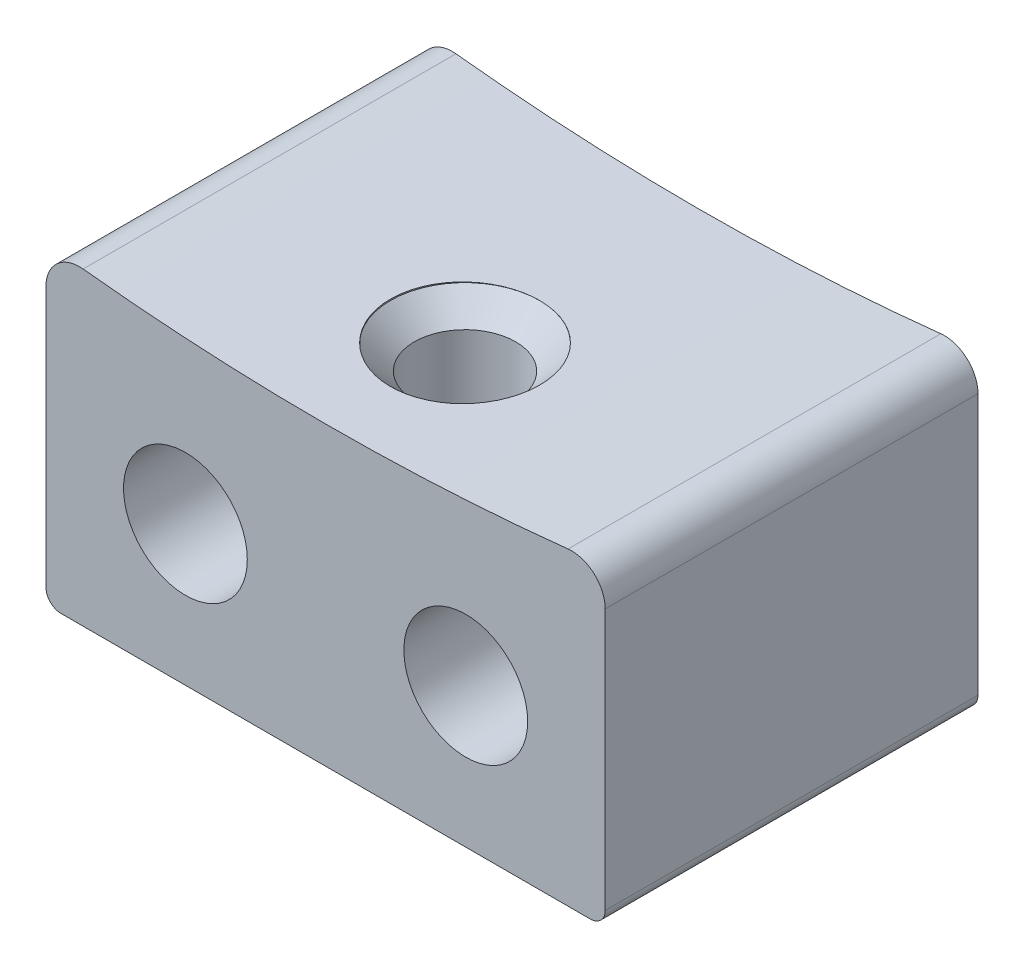
ISO-10303-21;
HEADER;
FILE_DESCRIPTION(('STEP AP214'),'2;1');
FILE_NAME('part.step','',(''),(''),'','','');
FILE_SCHEMA(('AUTOMOTIVE_DESIGN { 1 0 10303 214 1 1 1 1 }'));
ENDSEC;
DATA;
#1=APPLICATION_CONTEXT('core data for automotive mechanical design processes');
#2=APPLICATION_PROTOCOL_DEFINITION('international standard','automotive_design',2000,#1);
#3=PRODUCT_CONTEXT('',#1,'mechanical');
#4=PRODUCT('Part','Part','',(#3));
#5=PRODUCT_RELATED_PRODUCT_CATEGORY('part','',(#4));
#6=PRODUCT_DEFINITION_FORMATION('','',#4);
#7=PRODUCT_DEFINITION_CONTEXT('part definition',#1,'design');
#8=PRODUCT_DEFINITION('design','',#6,#7);
#9=PRODUCT_DEFINITION_SHAPE('','',#8);
#10=(LENGTH_UNIT() NAMED_UNIT(*) SI_UNIT(.MILLI.,.METRE.));
#11=(NAMED_UNIT(*) PLANE_ANGLE_UNIT() SI_UNIT($,.RADIAN.));
#12=(NAMED_UNIT(*) SI_UNIT($,.STERADIAN.) SOLID_ANGLE_UNIT());
#13=UNCERTAINTY_MEASURE_WITH_UNIT(LENGTH_MEASURE(1.E-05),#10,'distance_accuracy_value','');
#14=(GEOMETRIC_REPRESENTATION_CONTEXT(3) GLOBAL_UNCERTAINTY_ASSIGNED_CONTEXT((#13)) GLOBAL_UNIT_ASSIGNED_CONTEXT((#10,
#11,#12)) REPRESENTATION_CONTEXT('',''));
#15=CARTESIAN_POINT('',(0.,0.,0.));
#16=DIRECTION('',(0.,0.,1.));
#17=DIRECTION('',(1.,0.,0.));
#18=AXIS2_PLACEMENT_3D('',#15,#16,#17);
#19=CARTESIAN_POINT('',(-9.017,-86.8045,12.7));
#20=DIRECTION('',(0.,0.,-1.));
#21=DIRECTION('',(-1.,0.,0.));
#22=AXIS2_PLACEMENT_3D('',#19,#20,#21);
#23=CYLINDRICAL_SURFACE('',#22,0.507999999999997);
#24=CARTESIAN_POINT('',(-9.017,-86.8045,0.));
#25=DIRECTION('',(0.,0.,1.));
#26=DIRECTION('',(-1.,0.,0.));
#27=AXIS2_PLACEMENT_3D('',#24,#25,#26);
#28=CIRCLE('',#27,0.507999999999997);
#29=CARTESIAN_POINT('',(-9.525,-86.8045,0.));
#30=VERTEX_POINT('',#29);
#31=CARTESIAN_POINT('',(-9.017,-87.3125,0.));
#32=VERTEX_POINT('',#31);
#33=EDGE_CURVE('E150',#30,#32,#28,.T.);
#34=ORIENTED_EDGE('',*,*,#33,.T.);
#35=DIRECTION('',(0.,0.,-1.));
#36=VECTOR('',#35,1.);
#37=CARTESIAN_POINT('',(-9.017,-87.3125,12.7));
#38=LINE('',#37,#36);
#39=CARTESIAN_POINT('',(-9.017,-87.3125,12.7));
#40=VERTEX_POINT('',#39);
#41=EDGE_CURVE('E178',#40,#32,#38,.T.);
#42=ORIENTED_EDGE('',*,*,#41,.F.);
#43=CARTESIAN_POINT('',(-9.017,-86.8045,12.7));
#44=DIRECTION('',(0.,0.,1.));
#45=DIRECTION('',(-1.,0.,0.));
#46=AXIS2_PLACEMENT_3D('',#43,#44,#45);
#47=CIRCLE('',#46,0.507999999999997);
#48=CARTESIAN_POINT('',(-9.525,-86.8045,12.7));
#49=VERTEX_POINT('',#48);
#50=EDGE_CURVE('E166',#49,#40,#47,.T.);
#51=ORIENTED_EDGE('',*,*,#50,.F.);
#52=DIRECTION('',(0.,0.,-1.));
#53=VECTOR('',#52,1.);
#54=CARTESIAN_POINT('',(-9.525,-86.8045,12.7));
#55=LINE('',#54,#53);
#56=EDGE_CURVE('E145',#49,#30,#55,.T.);
#57=ORIENTED_EDGE('',*,*,#56,.T.);
#58=EDGE_LOOP('',(#34,#42,#51,#57));
#59=FACE_BOUND('',#58,.T.);
#60=ADVANCED_FACE('F39',(#59),#23,.T.);
#61=CARTESIAN_POINT('',(9.017,-87.3125,12.7));
#62=DIRECTION('',(0.,1.,0.));
#63=DIRECTION('',(0.,0.,1.));
#64=AXIS2_PLACEMENT_3D('',#61,#62,#63);
#65=PLANE('',#64);
#66=CARTESIAN_POINT('',(0.,-87.3125,7.9502));
#67=DIRECTION('',(0.,-1.,0.));
#68=DIRECTION('',(0.,0.,-1.));
#69=AXIS2_PLACEMENT_3D('',#66,#67,#68);
#70=CIRCLE('',#69,2.286);
#71=CARTESIAN_POINT('',(0.,-87.3125,5.6642));
#72=VERTEX_POINT('',#71);
#73=EDGE_CURVE('E192',#72,#72,#70,.T.);
#74=ORIENTED_EDGE('',*,*,#73,.F.);
#75=EDGE_LOOP('',(#74));
#76=FACE_BOUND('',#75,.T.);
#77=DIRECTION('',(1.,0.,0.));
#78=VECTOR('',#77,1.);
#79=CARTESIAN_POINT('',(9.017,-87.3125,0.));
#80=LINE('',#79,#78);
#81=CARTESIAN_POINT('',(9.017,-87.3125,0.));
#82=VERTEX_POINT('',#81);
#83=EDGE_CURVE('E153',#32,#82,#80,.T.);
#84=ORIENTED_EDGE('',*,*,#83,.T.);
#85=DIRECTION('',(0.,0.,-1.));
#86=VECTOR('',#85,1.);
#87=CARTESIAN_POINT('',(9.017,-87.3125,12.7));
#88=LINE('',#87,#86);
#89=CARTESIAN_POINT('',(9.017,-87.3125,12.7));
#90=VERTEX_POINT('',#89);
#91=EDGE_CURVE('E176',#90,#82,#88,.T.);
#92=ORIENTED_EDGE('',*,*,#91,.F.);
#93=DIRECTION('',(1.,0.,0.));
#94=VECTOR('',#93,1.);
#95=CARTESIAN_POINT('',(9.017,-87.3125,12.7));
#96=LINE('',#95,#94);
#97=EDGE_CURVE('E107',#40,#90,#96,.T.);
#98=ORIENTED_EDGE('',*,*,#97,.F.);
#99=ORIENTED_EDGE('',*,*,#41,.T.);
#100=EDGE_LOOP('',(#84,#92,#98,#99));
#101=FACE_BOUND('',#100,.T.);
#102=ADVANCED_FACE('F237',(#76,#101),#65,.F.);
#103=CARTESIAN_POINT('',(9.017,-86.8045,12.7));
#104=DIRECTION('',(0.,0.,-1.));
#105=DIRECTION('',(-1.,0.,0.));
#106=AXIS2_PLACEMENT_3D('',#103,#104,#105);
#107=CYLINDRICAL_SURFACE('',#106,0.507999999999997);
#108=CARTESIAN_POINT('',(9.017,-86.8045,0.));
#109=DIRECTION('',(0.,0.,1.));
#110=DIRECTION('',(-1.,0.,0.));
#111=AXIS2_PLACEMENT_3D('',#108,#109,#110);
#112=CIRCLE('',#111,0.507999999999997);
#113=CARTESIAN_POINT('',(9.525,-86.8045,0.));
#114=VERTEX_POINT('',#113);
#115=EDGE_CURVE('E156',#82,#114,#112,.T.);
#116=ORIENTED_EDGE('',*,*,#115,.T.);
#117=DIRECTION('',(0.,0.,-1.));
#118=VECTOR('',#117,1.);
#119=CARTESIAN_POINT('',(9.525,-86.8045,12.7));
#120=LINE('',#119,#118);
#121=CARTESIAN_POINT('',(9.525,-86.8045,12.7));
#122=VERTEX_POINT('',#121);
#123=EDGE_CURVE('E173',#122,#114,#120,.T.);
#124=ORIENTED_EDGE('',*,*,#123,.F.);
#125=CARTESIAN_POINT('',(9.017,-86.8045,12.7));
#126=DIRECTION('',(0.,0.,1.));
#127=DIRECTION('',(-1.,0.,0.));
#128=AXIS2_PLACEMENT_3D('',#125,#126,#127);
#129=CIRCLE('',#128,0.507999999999997);
#130=EDGE_CURVE('E215',#90,#122,#129,.T.);
#131=ORIENTED_EDGE('',*,*,#130,.F.);
#132=ORIENTED_EDGE('',*,*,#91,.T.);
#133=EDGE_LOOP('',(#116,#124,#131,#132));
#134=FACE_BOUND('',#133,.T.);
#135=ADVANCED_FACE('F240',(#134),#107,.T.);
#136=CARTESIAN_POINT('',(9.525,-77.9094022374707,12.7));
#137=DIRECTION('',(-1.,0.,0.));
#138=DIRECTION('',(0.,-1.,0.));
#139=AXIS2_PLACEMENT_3D('',#136,#137,#138);
#140=PLANE('',#139);
#141=DIRECTION('',(0.,1.,0.));
#142=VECTOR('',#141,1.);
#143=CARTESIAN_POINT('',(9.525,-77.9094022374707,0.));
#144=LINE('',#143,#142);
#145=CARTESIAN_POINT('',(9.525,-77.9094022374707,0.));
#146=VERTEX_POINT('',#145);
#147=EDGE_CURVE('E158',#114,#146,#144,.T.);
#148=ORIENTED_EDGE('',*,*,#147,.T.);
#149=DIRECTION('',(0.,0.,-1.));
#150=VECTOR('',#149,1.);
#151=CARTESIAN_POINT('',(9.525,-77.9094022374707,12.7));
#152=LINE('',#151,#150);
#153=CARTESIAN_POINT('',(9.525,-77.9094022374707,12.7));
#154=VERTEX_POINT('',#153);
#155=EDGE_CURVE('E170',#154,#146,#152,.T.);
#156=ORIENTED_EDGE('',*,*,#155,.F.);
#157=DIRECTION('',(0.,1.,0.));
#158=VECTOR('',#157,1.);
#159=CARTESIAN_POINT('',(9.525,-77.9094022374707,12.7));
#160=LINE('',#159,#158);
#161=EDGE_CURVE('E220',#122,#154,#160,.T.);
#162=ORIENTED_EDGE('',*,*,#161,.F.);
#163=ORIENTED_EDGE('',*,*,#123,.T.);
#164=EDGE_LOOP('',(#148,#156,#162,#163));
#165=FACE_BOUND('',#164,.T.);
#166=ADVANCED_FACE('F226',(#165),#140,.F.);
#167=CARTESIAN_POINT('',(8.382,-77.9094022374707,12.7));
#168=DIRECTION('',(0.,0.,-1.));
#169=DIRECTION('',(-1.,0.,0.));
#170=AXIS2_PLACEMENT_3D('',#167,#168,#169);
#171=CYLINDRICAL_SURFACE('',#170,1.143);
#172=CARTESIAN_POINT('',(8.382,-77.9094022374707,0.));
#173=DIRECTION('',(0.,0.,1.));
#174=DIRECTION('',(-1.,0.,0.));
#175=AXIS2_PLACEMENT_3D('',#172,#173,#174);
#176=CIRCLE('',#175,1.143);
#177=CARTESIAN_POINT('',(8.25973419773096,-76.7729603895983,0.));
#178=VERTEX_POINT('',#177);
#179=EDGE_CURVE('E160',#146,#178,#176,.T.);
#180=ORIENTED_EDGE('',*,*,#179,.T.);
#181=DIRECTION('',(0.,0.,-1.));
#182=VECTOR('',#181,1.);
#183=CARTESIAN_POINT('',(8.25973419773096,-76.7729603895983,12.7));
#184=LINE('',#183,#182);
#185=CARTESIAN_POINT('',(8.25973419773096,-76.7729603895983,12.7));
#186=VERTEX_POINT('',#185);
#187=EDGE_CURVE('E140',#186,#178,#184,.T.);
#188=ORIENTED_EDGE('',*,*,#187,.F.);
#189=CARTESIAN_POINT('',(8.382,-77.9094022374707,12.7));
#190=DIRECTION('',(0.,0.,1.));
#191=DIRECTION('',(-1.,0.,0.));
#192=AXIS2_PLACEMENT_3D('',#189,#190,#191);
#193=CIRCLE('',#192,1.143);
#194=EDGE_CURVE('E128',#154,#186,#193,.T.);
#195=ORIENTED_EDGE('',*,*,#194,.F.);
#196=ORIENTED_EDGE('',*,*,#155,.T.);
#197=EDGE_LOOP('',(#180,#188,#195,#196));
#198=FACE_BOUND('',#197,.T.);
#199=ADVANCED_FACE('F230',(#198),#171,.T.);
#200=CARTESIAN_POINT('',(0.,0.,12.7));
#201=DIRECTION('',(0.,0.,-1.));
#202=DIRECTION('',(-1.,0.,0.));
#203=AXIS2_PLACEMENT_3D('',#200,#201,#202);
#204=CYLINDRICAL_SURFACE('',#203,77.216);
#205=CARTESIAN_POINT('',(0.,-77.216,5.4102));
#206=CARTESIAN_POINT('',(0.142631522054867,-77.2159994376022,5.41020631241256));
#207=CARTESIAN_POINT('',(0.285365482974128,-77.2156005630109,5.42225435536695));
#208=CARTESIAN_POINT('',(0.566899598449221,-77.2140477185647,5.4701476102734));
#209=CARTESIAN_POINT('',(0.705694855219714,-77.2128928481651,5.50602120404428));
#210=CARTESIAN_POINT('',(0.975232281978908,-77.2099587896718,5.60054067047672));
#211=CARTESIAN_POINT('',(1.10597837369403,-77.2081799084851,5.65917535006933));
#212=CARTESIAN_POINT('',(1.35573536611048,-77.2041984471788,5.79753637747094));
#213=CARTESIAN_POINT('',(1.47474911110521,-77.2019959701363,5.87725759588643));
#214=CARTESIAN_POINT('',(1.69776130614018,-77.1974140082537,6.05557669508534));
#215=CARTESIAN_POINT('',(1.80175309174933,-77.1950344455553,6.15418290927587));
#216=CARTESIAN_POINT('',(1.99171320334718,-77.190367187809,6.3674579297261));
#217=CARTESIAN_POINT('',(2.07768080946089,-77.1880794964334,6.48212737723677));
#218=CARTESIAN_POINT('',(2.22916444437867,-77.1838535353486,6.72430084112169));
#219=CARTESIAN_POINT('',(2.2946762068322,-77.181915338567,6.85180752755713));
#220=CARTESIAN_POINT('',(2.40336085350253,-77.1786076969655,7.11601704578485));
#221=CARTESIAN_POINT('',(2.44653383639373,-77.1772382496333,7.25271983695328));
#222=CARTESIAN_POINT('',(2.50930034841734,-77.1752231221408,7.5313882946801));
#223=CARTESIAN_POINT('',(2.52890247244731,-77.1745771781675,7.67335202340928));
#224=CARTESIAN_POINT('',(2.54399731928591,-77.1740810982679,7.95855644407232));
#225=CARTESIAN_POINT('',(2.53949014902687,-77.1742309588121,8.10179713033964));
#226=CARTESIAN_POINT('',(2.50650159316738,-77.1753093428756,8.3854310733836));
#227=CARTESIAN_POINT('',(2.4780294960392,-77.1762375647124,8.52582541177812));
#228=CARTESIAN_POINT('',(2.39793367691424,-77.1787675603712,8.79984057602987));
#229=CARTESIAN_POINT('',(2.34630989860137,-77.1803693358317,8.93346138540973));
#230=CARTESIAN_POINT('',(2.22136547301627,-77.1840662239566,9.19016638077214));
#231=CARTESIAN_POINT('',(2.14804057083833,-77.1861614333514,9.31324849434153));
#232=CARTESIAN_POINT('',(1.98177847491137,-77.1906089003664,9.54535951885899));
#233=CARTESIAN_POINT('',(1.88884122569133,-77.1929611587136,9.65438839005785));
#234=CARTESIAN_POINT('',(1.68594005697315,-77.1976589020917,9.85535210172363));
#235=CARTESIAN_POINT('',(1.57596808485946,-77.2000043833819,9.9472788122256));
#236=CARTESIAN_POINT('',(1.34214757008214,-77.2044230953484,10.1113661329868));
#237=CARTESIAN_POINT('',(1.21829902506159,-77.2064963259785,10.1835267398888));
#238=CARTESIAN_POINT('',(0.960236436256255,-77.2101368689054,10.3060325778709));
#239=CARTESIAN_POINT('',(0.826022269501625,-77.2117041751992,10.3563775501001));
#240=CARTESIAN_POINT('',(0.551040342063302,-77.2141561026902,10.4338177997925));
#241=CARTESIAN_POINT('',(0.410272602771392,-77.2150407261155,10.4609131531402));
#242=CARTESIAN_POINT('',(0.12625006154137,-77.21602728625,10.4910750560383));
#243=CARTESIAN_POINT('',(-0.0170035446167213,-77.2161295893622,10.4941528543291));
#244=CARTESIAN_POINT('',(-0.301993402081631,-77.2155409479603,10.4762215980717));
#245=CARTESIAN_POINT('',(-0.443729655516764,-77.2148500045589,10.4552125773133));
#246=CARTESIAN_POINT('',(-0.721630040944338,-77.2127529709905,10.38971336344));
#247=CARTESIAN_POINT('',(-0.857795378768305,-77.2113470364786,10.3452282810321));
#248=CARTESIAN_POINT('',(-1.12072572209503,-77.207978432383,10.2340449009893));
#249=CARTESIAN_POINT('',(-1.24749070467931,-77.2060157614421,10.1673465491997));
#250=CARTESIAN_POINT('',(-1.48807369676405,-77.2017538339517,10.0136010102115));
#251=CARTESIAN_POINT('',(-1.60188686823058,-77.1994544523555,9.92654625591123));
#252=CARTESIAN_POINT('',(-1.81328689850725,-77.1947786399363,9.73457018420843));
#253=CARTESIAN_POINT('',(-1.9108737087612,-77.1924022088827,9.6296488133433));
#254=CARTESIAN_POINT('',(-2.08708847748782,-77.1878391511334,9.40486962095666));
#255=CARTESIAN_POINT('',(-2.16570917550576,-77.1856525973293,9.28500610595163));
#256=CARTESIAN_POINT('',(-2.30171033073772,-77.18171696949,9.0337741278486));
#257=CARTESIAN_POINT('',(-2.35909084090961,-77.1799678943642,8.90240569343665));
#258=CARTESIAN_POINT('',(-2.45097008132182,-77.1771049527143,8.63192023061876));
#259=CARTESIAN_POINT('',(-2.4854735015185,-77.1759909560017,8.49280479674247));
#260=CARTESIAN_POINT('',(-2.53063450579084,-77.1745234081916,8.2107517627199));
#261=CARTESIAN_POINT('',(-2.54129212382609,-77.1741698560111,8.06781416801718));
#262=CARTESIAN_POINT('',(-2.53845845999533,-77.1742631065776,7.78224687430622));
#263=CARTESIAN_POINT('',(-2.5249786228346,-77.1747095300184,7.63961706146633));
#264=CARTESIAN_POINT('',(-2.47427624849965,-77.176351609056,7.35864617980979));
#265=CARTESIAN_POINT('',(-2.43705366442707,-77.1775472661328,7.22030511946514));
#266=CARTESIAN_POINT('',(-2.33992416042715,-77.1805529646628,6.95183481305016));
#267=CARTESIAN_POINT('',(-2.28001687710298,-77.1823630159583,6.82170569856982));
#268=CARTESIAN_POINT('',(-2.13922195709609,-77.1863933830043,6.5733543791145));
#269=CARTESIAN_POINT('',(-2.05833506599703,-77.1886136841744,6.45513175120817));
#270=CARTESIAN_POINT('',(-1.87784141167219,-77.1932153590161,6.23389552981776));
#271=CARTESIAN_POINT('',(-1.77822778169667,-77.1955967915658,6.13088754008034));
#272=CARTESIAN_POINT('',(-1.56309209917837,-77.2002522635232,5.94302824418242));
#273=CARTESIAN_POINT('',(-1.44756611655477,-77.202526276213,5.85818143678861));
#274=CARTESIAN_POINT('',(-1.20383476785368,-77.2067114569743,5.70903574084065));
#275=CARTESIAN_POINT('',(-1.07562079418507,-77.2086223761193,5.64475092851086));
#276=CARTESIAN_POINT('',(-0.81031216719086,-77.2118616311625,5.53869486915874));
#277=CARTESIAN_POINT('',(-0.673228311805865,-77.2131906606722,5.49689680429824));
#278=CARTESIAN_POINT('',(-0.446066762197211,-77.2147615976945,5.44806475218426));
#279=CARTESIAN_POINT('',(-0.357463191874608,-77.2152239806023,5.43388336630485));
#280=CARTESIAN_POINT('',(-0.179253236550343,-77.21584335844,5.41494900814971));
#281=CARTESIAN_POINT('',(-0.0896468519055765,-77.2160003534786,5.41019603251858));
#282=CARTESIAN_POINT('',(0.,-77.216,5.4102));
#283=B_SPLINE_CURVE_WITH_KNOTS('',3,(#205,#206,#207,#208,#209,#210,#211,#212,#213,#214,#215,
#216,#217,#218,#219,#220,#221,#222,#223,#224,#225,#226,#227,#228,#229,#230,#231,#232,#233,#234,
#235,#236,#237,#238,#239,#240,#241,#242,#243,#244,#245,#246,#247,#248,#249,#250,#251,#252,#253,
#254,#255,#256,#257,#258,#259,#260,#261,#262,#263,#264,#265,#266,#267,#268,#269,#270,#271,#272,
#273,#274,#275,#276,#277,#278,#279,#280,#281,#282),.UNSPECIFIED.,.T.,.F.,(4,2,2,2,2,2,2,2,2,2,2,
2,2,2,2,2,2,2,2,2,2,2,2,2,2,2,2,2,2,2,2,2,2,2,2,2,2,2,4),(0.,0.427567341049227,
0.855644930821324,1.28351227384319,1.71127563181474,2.13922818622518,2.56719782955109,
2.99525667236662,3.42331362435328,3.85121444191874,4.27911336161047,4.70684650996244,
5.13458069877406,5.56239880838705,5.99021812804495,6.41824030615944,6.84626255697298,
7.27428988629669,7.70231581857681,8.13014127076064,8.55796612277637,8.98569787629391,
9.41343067260576,9.84132272385087,10.2692160555084,10.6972729308393,11.1253287388946,
11.5532967654928,11.9812641826069,12.4090287339239,12.8367941301944,13.2645663793292,
13.6923234281651,14.1202376346443,14.5482577188113,14.9765701907332,15.4043707156992,
15.6731056993231,15.9418405873092),.UNSPECIFIED.);
#284=CARTESIAN_POINT('',(0.,-77.216,10.4902));
#285=VERTEX_POINT('',#284);
#286=CARTESIAN_POINT('',(0.,-77.216,5.41020000000001));
#287=VERTEX_POINT('',#286);
#288=EDGE_CURVE('E42',#285,#287,#283,.T.);
#289=ORIENTED_EDGE('',*,*,#288,.T.);
#290=EDGE_CURVE('E12',#287,#285,#283,.T.);
#291=ORIENTED_EDGE('',*,*,#290,.T.);
#292=EDGE_LOOP('',(#289,#291));
#293=FACE_BOUND('',#292,.T.);
#294=CARTESIAN_POINT('',(0.,0.,0.));
#295=DIRECTION('',(0.,0.,-1.));
#296=DIRECTION('',(1.,0.,0.));
#297=AXIS2_PLACEMENT_3D('',#294,#295,#296);
#298=CIRCLE('',#297,77.216);
#299=CARTESIAN_POINT('',(-8.25973419773096,-76.7729603895983,0.));
#300=VERTEX_POINT('',#299);
#301=EDGE_CURVE('E137',#178,#300,#298,.T.);
#302=ORIENTED_EDGE('',*,*,#301,.T.);
#303=DIRECTION('',(0.,0.,-1.));
#304=VECTOR('',#303,1.);
#305=CARTESIAN_POINT('',(-8.25973419773096,-76.7729603895983,12.7));
#306=LINE('',#305,#304);
#307=CARTESIAN_POINT('',(-8.25973419773096,-76.7729603895983,12.7));
#308=VERTEX_POINT('',#307);
#309=EDGE_CURVE('E134',#308,#300,#306,.T.);
#310=ORIENTED_EDGE('',*,*,#309,.F.);
#311=CARTESIAN_POINT('',(0.,0.,12.7));
#312=DIRECTION('',(0.,0.,-1.));
#313=DIRECTION('',(1.,0.,0.));
#314=AXIS2_PLACEMENT_3D('',#311,#312,#313);
#315=CIRCLE('',#314,77.216);
#316=EDGE_CURVE('E121',#186,#308,#315,.T.);
#317=ORIENTED_EDGE('',*,*,#316,.F.);
#318=ORIENTED_EDGE('',*,*,#187,.T.);
#319=EDGE_LOOP('',(#302,#310,#317,#318));
#320=FACE_BOUND('',#319,.T.);
#321=ADVANCED_FACE('F135',(#293,#320),#204,.F.);
#322=CARTESIAN_POINT('',(-8.382,-77.9094022374707,12.7));
#323=DIRECTION('',(0.,0.,-1.));
#324=DIRECTION('',(-1.,0.,0.));
#325=AXIS2_PLACEMENT_3D('',#322,#323,#324);
#326=CYLINDRICAL_SURFACE('',#325,1.143);
#327=CARTESIAN_POINT('',(-8.382,-77.9094022374707,0.));
#328=DIRECTION('',(0.,0.,1.));
#329=DIRECTION('',(1.,0.,0.));
#330=AXIS2_PLACEMENT_3D('',#327,#328,#329);
#331=CIRCLE('',#330,1.143);
#332=CARTESIAN_POINT('',(-9.525,-77.9094022374707,0.));
#333=VERTEX_POINT('',#332);
#334=EDGE_CURVE('E163',#300,#333,#331,.T.);
#335=ORIENTED_EDGE('',*,*,#334,.T.);
#336=DIRECTION('',(0.,0.,-1.));
#337=VECTOR('',#336,1.);
#338=CARTESIAN_POINT('',(-9.525,-77.9094022374707,12.7));
#339=LINE('',#338,#337);
#340=CARTESIAN_POINT('',(-9.525,-77.9094022374707,12.7));
#341=VERTEX_POINT('',#340);
#342=EDGE_CURVE('E141',#341,#333,#339,.T.);
#343=ORIENTED_EDGE('',*,*,#342,.F.);
#344=CARTESIAN_POINT('',(-8.382,-77.9094022374707,12.7));
#345=DIRECTION('',(0.,0.,1.));
#346=DIRECTION('',(1.,0.,0.));
#347=AXIS2_PLACEMENT_3D('',#344,#345,#346);
#348=CIRCLE('',#347,1.143);
#349=EDGE_CURVE('E125',#308,#341,#348,.T.);
#350=ORIENTED_EDGE('',*,*,#349,.F.);
#351=ORIENTED_EDGE('',*,*,#309,.T.);
#352=EDGE_LOOP('',(#335,#343,#350,#351));
#353=FACE_BOUND('',#352,.T.);
#354=ADVANCED_FACE('F143',(#353),#326,.T.);
#355=CARTESIAN_POINT('',(-9.525,-86.8045,12.7));
#356=DIRECTION('',(1.,0.,0.));
#357=DIRECTION('',(0.,1.,0.));
#358=AXIS2_PLACEMENT_3D('',#355,#356,#357);
#359=PLANE('',#358);
#360=DIRECTION('',(0.,-1.,0.));
#361=VECTOR('',#360,1.);
#362=CARTESIAN_POINT('',(-9.525,-86.8045,0.));
#363=LINE('',#362,#361);
#364=EDGE_CURVE('E98',#333,#30,#363,.T.);
#365=ORIENTED_EDGE('',*,*,#364,.T.);
#366=ORIENTED_EDGE('',*,*,#56,.F.);
#367=DIRECTION('',(0.,-1.,0.));
#368=VECTOR('',#367,1.);
#369=CARTESIAN_POINT('',(-9.525,-86.8045,12.7));
#370=LINE('',#369,#368);
#371=EDGE_CURVE('E65',#341,#49,#370,.T.);
#372=ORIENTED_EDGE('',*,*,#371,.F.);
#373=ORIENTED_EDGE('',*,*,#342,.T.);
#374=EDGE_LOOP('',(#365,#366,#372,#373));
#375=FACE_BOUND('',#374,.T.);
#376=ADVANCED_FACE('F234',(#375),#359,.F.);
#377=CARTESIAN_POINT('',(-9.017,-86.8045,12.7));
#378=DIRECTION('',(0.,0.,-1.));
#379=DIRECTION('',(-1.,0.,0.));
#380=AXIS2_PLACEMENT_3D('',#377,#378,#379);
#381=PLANE('',#380);
#382=CARTESIAN_POINT('',(4.77520000000001,-82.55,12.7));
#383=DIRECTION('',(0.,0.,1.));
#384=DIRECTION('',(1.,0.,0.));
#385=AXIS2_PLACEMENT_3D('',#382,#383,#384);
#386=CIRCLE('',#385,2.1082);
#387=CARTESIAN_POINT('',(6.88340000000001,-82.55,12.7));
#388=VERTEX_POINT('',#387);
#389=EDGE_CURVE('E202',#388,#388,#386,.T.);
#390=ORIENTED_EDGE('',*,*,#389,.F.);
#391=EDGE_LOOP('',(#390));
#392=FACE_BOUND('',#391,.T.);
#393=CARTESIAN_POINT('',(-4.77519999999999,-82.55,12.7));
#394=DIRECTION('',(0.,0.,1.));
#395=DIRECTION('',(1.,0.,0.));
#396=AXIS2_PLACEMENT_3D('',#393,#394,#395);
#397=CIRCLE('',#396,2.1082);
#398=CARTESIAN_POINT('',(-2.66699999999999,-82.55,12.7));
#399=VERTEX_POINT('',#398);
#400=EDGE_CURVE('E390',#399,#399,#397,.T.);
#401=ORIENTED_EDGE('',*,*,#400,.F.);
#402=EDGE_LOOP('',(#401));
#403=FACE_BOUND('',#402,.T.);
#404=ORIENTED_EDGE('',*,*,#50,.T.);
#405=ORIENTED_EDGE('',*,*,#97,.T.);
#406=ORIENTED_EDGE('',*,*,#130,.T.);
#407=ORIENTED_EDGE('',*,*,#161,.T.);
#408=ORIENTED_EDGE('',*,*,#194,.T.);
#409=ORIENTED_EDGE('',*,*,#316,.T.);
#410=ORIENTED_EDGE('',*,*,#349,.T.);
#411=ORIENTED_EDGE('',*,*,#371,.T.);
#412=EDGE_LOOP('',(#404,#405,#406,#407,#408,#409,#410,#411));
#413=FACE_BOUND('',#412,.T.);
#414=ADVANCED_FACE('F123',(#392,#403,#413),#381,.F.);
#415=CARTESIAN_POINT('',(-9.017,-86.8045,0.));
#416=DIRECTION('',(0.,0.,-1.));
#417=DIRECTION('',(-1.,0.,0.));
#418=AXIS2_PLACEMENT_3D('',#415,#416,#417);
#419=PLANE('',#418);
#420=CARTESIAN_POINT('',(4.77520000000001,-82.55,0.));
#421=DIRECTION('',(0.,0.,-1.));
#422=DIRECTION('',(-1.,0.,0.));
#423=AXIS2_PLACEMENT_3D('',#420,#421,#422);
#424=CIRCLE('',#423,2.1082);
#425=CARTESIAN_POINT('',(2.66700000000001,-82.55,0.));
#426=VERTEX_POINT('',#425);
#427=EDGE_CURVE('E206',#426,#426,#424,.T.);
#428=ORIENTED_EDGE('',*,*,#427,.F.);
#429=EDGE_LOOP('',(#428));
#430=FACE_BOUND('',#429,.T.);
#431=CARTESIAN_POINT('',(-4.77519999999999,-82.55,0.));
#432=DIRECTION('',(0.,0.,-1.));
#433=DIRECTION('',(-1.,0.,0.));
#434=AXIS2_PLACEMENT_3D('',#431,#432,#433);
#435=CIRCLE('',#434,2.1082);
#436=CARTESIAN_POINT('',(-6.88339999999999,-82.55,0.));
#437=VERTEX_POINT('',#436);
#438=EDGE_CURVE('E154',#437,#437,#435,.T.);
#439=ORIENTED_EDGE('',*,*,#438,.F.);
#440=EDGE_LOOP('',(#439));
#441=FACE_BOUND('',#440,.T.);
#442=ORIENTED_EDGE('',*,*,#33,.F.);
#443=ORIENTED_EDGE('',*,*,#364,.F.);
#444=ORIENTED_EDGE('',*,*,#334,.F.);
#445=ORIENTED_EDGE('',*,*,#301,.F.);
#446=ORIENTED_EDGE('',*,*,#179,.F.);
#447=ORIENTED_EDGE('',*,*,#147,.F.);
#448=ORIENTED_EDGE('',*,*,#115,.F.);
#449=ORIENTED_EDGE('',*,*,#83,.F.);
#450=EDGE_LOOP('',(#442,#443,#444,#445,#446,#447,#448,#449));
#451=FACE_BOUND('',#450,.T.);
#452=ADVANCED_FACE('F233',(#430,#441,#451),#419,.T.);
#453=CARTESIAN_POINT('',(-4.77519999999999,-82.55,12.7));
#454=DIRECTION('',(0.,0.,1.));
#455=DIRECTION('',(1.,0.,0.));
#456=AXIS2_PLACEMENT_3D('',#453,#454,#455);
#457=CYLINDRICAL_SURFACE('',#456,2.1082);
#458=ORIENTED_EDGE('',*,*,#438,.T.);
#459=EDGE_LOOP('',(#458));
#460=FACE_BOUND('',#459,.T.);
#461=ORIENTED_EDGE('',*,*,#400,.T.);
#462=EDGE_LOOP('',(#461));
#463=FACE_BOUND('',#462,.T.);
#464=ADVANCED_FACE('F325',(#460,#463),#457,.F.);
#465=CARTESIAN_POINT('',(4.77520000000001,-82.55,12.7));
#466=DIRECTION('',(0.,0.,1.));
#467=DIRECTION('',(1.,0.,0.));
#468=AXIS2_PLACEMENT_3D('',#465,#466,#467);
#469=CYLINDRICAL_SURFACE('',#468,2.1082);
#470=ORIENTED_EDGE('',*,*,#427,.T.);
#471=EDGE_LOOP('',(#470));
#472=FACE_BOUND('',#471,.T.);
#473=ORIENTED_EDGE('',*,*,#389,.T.);
#474=EDGE_LOOP('',(#473));
#475=FACE_BOUND('',#474,.T.);
#476=ADVANCED_FACE('F263',(#472,#475),#469,.F.);
#477=CARTESIAN_POINT('',(0.,-77.216,7.9502));
#478=DIRECTION('',(0.,-1.,0.));
#479=DIRECTION('',(0.,0.,-1.));
#480=AXIS2_PLACEMENT_3D('',#477,#478,#479);
#481=CYLINDRICAL_SURFACE('',#480,2.54);
#482=CARTESIAN_POINT('',(0.,-77.216,7.9502));
#483=DIRECTION('',(0.,-1.,0.));
#484=DIRECTION('',(0.,0.,-1.));
#485=AXIS2_PLACEMENT_3D('',#482,#483,#484);
#486=CIRCLE('',#485,2.54);
#487=EDGE_CURVE('E56',#287,#285,#486,.T.);
#488=ORIENTED_EDGE('',*,*,#487,.T.);
#489=ORIENTED_EDGE('',*,*,#290,.F.);
#490=EDGE_LOOP('',(#488,#489));
#491=FACE_BOUND('',#490,.T.);
#492=ADVANCED_FACE('F191',(#491),#481,.F.);
#493=EDGE_CURVE('E186',#285,#287,#486,.T.);
#494=ORIENTED_EDGE('',*,*,#493,.T.);
#495=ORIENTED_EDGE('',*,*,#288,.F.);
#496=EDGE_LOOP('',(#494,#495));
#497=FACE_BOUND('',#496,.T.);
#498=ADVANCED_FACE('F185',(#497),#481,.F.);
#499=CARTESIAN_POINT('',(0.,-78.0288,7.9502));
#500=DIRECTION('',(0.,1.,0.));
#501=DIRECTION('',(0.,0.,1.));
#502=AXIS2_PLACEMENT_3D('',#499,#500,#501);
#503=CONICAL_SURFACE('',#502,1.7272,0.785398163397447);
#504=ORIENTED_EDGE('',*,*,#487,.F.);
#505=ORIENTED_EDGE('',*,*,#493,.F.);
#506=EDGE_LOOP('',(#504,#505));
#507=FACE_BOUND('',#506,.T.);
#508=CARTESIAN_POINT('',(0.,-78.0288,7.9502));
#509=DIRECTION('',(0.,-1.,0.));
#510=DIRECTION('',(0.,0.,-1.));
#511=AXIS2_PLACEMENT_3D('',#508,#509,#510);
#512=CIRCLE('',#511,1.7272);
#513=CARTESIAN_POINT('',(0.,-78.0288,6.223));
#514=VERTEX_POINT('',#513);
#515=EDGE_CURVE('E199',#514,#514,#512,.T.);
#516=ORIENTED_EDGE('',*,*,#515,.T.);
#517=EDGE_LOOP('',(#516));
#518=FACE_BOUND('',#517,.T.);
#519=ADVANCED_FACE('F187',(#507,#518),#503,.F.);
#520=CARTESIAN_POINT('',(0.,-87.3125,7.9502));
#521=DIRECTION('',(0.,-1.,0.));
#522=DIRECTION('',(0.,0.,-1.));
#523=AXIS2_PLACEMENT_3D('',#520,#521,#522);
#524=CYLINDRICAL_SURFACE('',#523,1.7272);
#525=ORIENTED_EDGE('',*,*,#515,.F.);
#526=EDGE_LOOP('',(#525));
#527=FACE_BOUND('',#526,.T.);
#528=CARTESIAN_POINT('',(0.,-86.7537,7.9502));
#529=DIRECTION('',(0.,-1.,0.));
#530=DIRECTION('',(0.,0.,-1.));
#531=AXIS2_PLACEMENT_3D('',#528,#529,#530);
#532=CIRCLE('',#531,1.7272);
#533=CARTESIAN_POINT('',(0.,-86.7537,6.223));
#534=VERTEX_POINT('',#533);
#535=EDGE_CURVE('E194',#534,#534,#532,.T.);
#536=ORIENTED_EDGE('',*,*,#535,.T.);
#537=EDGE_LOOP('',(#536));
#538=FACE_BOUND('',#537,.T.);
#539=ADVANCED_FACE('F297',(#527,#538),#524,.F.);
#540=CARTESIAN_POINT('',(0.,-87.3125,7.9502));
#541=DIRECTION('',(0.,-1.,0.));
#542=DIRECTION('',(0.,0.,-1.));
#543=AXIS2_PLACEMENT_3D('',#540,#541,#542);
#544=CONICAL_SURFACE('',#543,2.286,0.78539816339745);
#545=ORIENTED_EDGE('',*,*,#535,.F.);
#546=EDGE_LOOP('',(#545));
#547=FACE_BOUND('',#546,.T.);
#548=ORIENTED_EDGE('',*,*,#73,.T.);
#549=EDGE_LOOP('',(#548));
#550=FACE_BOUND('',#549,.T.);
#551=ADVANCED_FACE('F306',(#547,#550),#544,.F.);
#552=CLOSED_SHELL('',(#60,#102,#135,#166,#199,#321,#354,#376,#414,#452,#464,#476,#492,#498,#519,
#539,#551));
#553=MANIFOLD_SOLID_BREP('B2',#552);
#554=ADVANCED_BREP_SHAPE_REPRESENTATION('',(#18,#553),#14);
#555=SHAPE_DEFINITION_REPRESENTATION(#9,#554);
ENDSEC;
END-ISO-10303-21;
